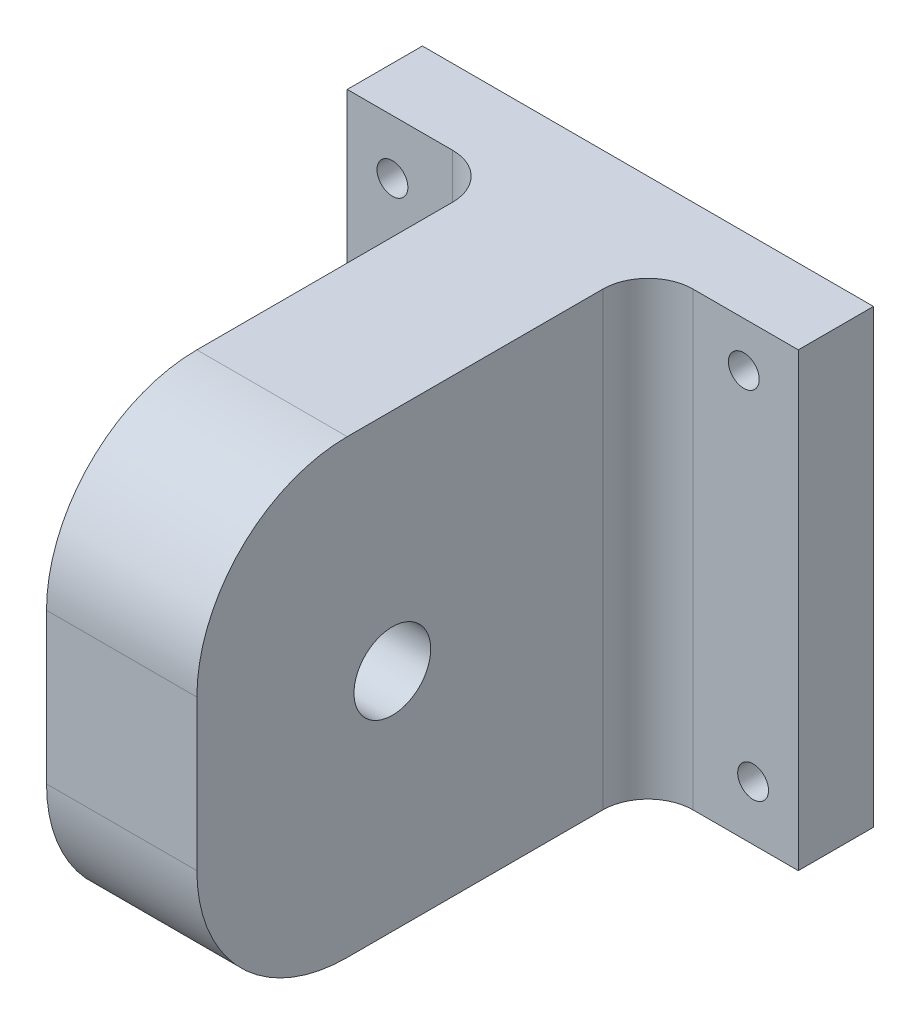
ISO-10303-21;
HEADER;
FILE_DESCRIPTION(('STEP AP214'),'2;1');
FILE_NAME('part.step','',(''),(''),'','','');
FILE_SCHEMA(('AUTOMOTIVE_DESIGN { 1 0 10303 214 1 1 1 1 }'));
ENDSEC;
DATA;
#1=APPLICATION_CONTEXT('core data for automotive mechanical design processes');
#2=APPLICATION_PROTOCOL_DEFINITION('international standard','automotive_design',2000,#1);
#3=PRODUCT_CONTEXT('',#1,'mechanical');
#4=PRODUCT('Part','Part','',(#3));
#5=PRODUCT_RELATED_PRODUCT_CATEGORY('part','',(#4));
#6=PRODUCT_DEFINITION_FORMATION('','',#4);
#7=PRODUCT_DEFINITION_CONTEXT('part definition',#1,'design');
#8=PRODUCT_DEFINITION('design','',#6,#7);
#9=PRODUCT_DEFINITION_SHAPE('','',#8);
#10=(LENGTH_UNIT() NAMED_UNIT(*) SI_UNIT(.MILLI.,.METRE.));
#11=(NAMED_UNIT(*) PLANE_ANGLE_UNIT() SI_UNIT($,.RADIAN.));
#12=(NAMED_UNIT(*) SI_UNIT($,.STERADIAN.) SOLID_ANGLE_UNIT());
#13=UNCERTAINTY_MEASURE_WITH_UNIT(LENGTH_MEASURE(1.E-05),#10,'distance_accuracy_value','');
#14=(GEOMETRIC_REPRESENTATION_CONTEXT(3) GLOBAL_UNCERTAINTY_ASSIGNED_CONTEXT((#13)) GLOBAL_UNIT_ASSIGNED_CONTEXT((#10,
#11,#12)) REPRESENTATION_CONTEXT('',''));
#15=CARTESIAN_POINT('',(0.,0.,0.));
#16=DIRECTION('',(0.,0.,1.));
#17=DIRECTION('',(1.,0.,0.));
#18=AXIS2_PLACEMENT_3D('',#15,#16,#17);
#19=CARTESIAN_POINT('',(0.,0.,5.));
#20=DIRECTION('',(0.,0.,1.));
#21=DIRECTION('',(1.,0.,0.));
#22=AXIS2_PLACEMENT_3D('',#19,#20,#21);
#23=PLANE('',#22);
#24=DIRECTION('',(1.,0.,0.));
#25=VECTOR('',#24,1.);
#26=CARTESIAN_POINT('',(-15.,-15.,5.));
#27=LINE('',#26,#25);
#28=CARTESIAN_POINT('',(-15.,-15.,5.));
#29=VERTEX_POINT('',#28);
#30=CARTESIAN_POINT('',(-8.,-15.,5.));
#31=VERTEX_POINT('',#30);
#32=EDGE_CURVE('E268',#29,#31,#27,.T.);
#33=ORIENTED_EDGE('',*,*,#32,.T.);
#34=DIRECTION('',(0.,-1.,0.));
#35=VECTOR('',#34,1.);
#36=CARTESIAN_POINT('',(-8.,0.,5.));
#37=LINE('',#36,#35);
#38=CARTESIAN_POINT('',(-8.,15.,5.));
#39=VERTEX_POINT('',#38);
#40=EDGE_CURVE('E61',#31,#39,#37,.F.);
#41=ORIENTED_EDGE('',*,*,#40,.T.);
#42=DIRECTION('',(-1.,0.,0.));
#43=VECTOR('',#42,1.);
#44=CARTESIAN_POINT('',(-15.,15.,5.));
#45=LINE('',#44,#43);
#46=CARTESIAN_POINT('',(-15.,15.,5.));
#47=VERTEX_POINT('',#46);
#48=EDGE_CURVE('E141',#39,#47,#45,.T.);
#49=ORIENTED_EDGE('',*,*,#48,.T.);
#50=DIRECTION('',(0.,-1.,0.));
#51=VECTOR('',#50,1.);
#52=CARTESIAN_POINT('',(-15.,15.,5.));
#53=LINE('',#52,#51);
#54=EDGE_CURVE('E140',#47,#29,#53,.T.);
#55=ORIENTED_EDGE('',*,*,#54,.T.);
#56=EDGE_LOOP('',(#33,#41,#49,#55));
#57=FACE_BOUND('',#56,.T.);
#58=CARTESIAN_POINT('',(-11.9939671001348,11.375061324506,5.));
#59=DIRECTION('',(0.,0.,1.));
#60=DIRECTION('',(1.,0.,0.));
#61=AXIS2_PLACEMENT_3D('',#58,#59,#60);
#62=CIRCLE('',#61,1.02617269029984);
#63=CARTESIAN_POINT('',(-10.967794409835,11.375061324506,5.));
#64=VERTEX_POINT('',#63);
#65=EDGE_CURVE('E243',#64,#64,#62,.T.);
#66=ORIENTED_EDGE('',*,*,#65,.F.);
#67=EDGE_LOOP('',(#66));
#68=FACE_BOUND('',#67,.T.);
#69=CARTESIAN_POINT('',(-11.3750613245053,-11.9939671001348,5.));
#70=DIRECTION('',(0.,0.,1.));
#71=DIRECTION('',(1.,0.,0.));
#72=AXIS2_PLACEMENT_3D('',#69,#70,#71);
#73=CIRCLE('',#72,1.02617269030017);
#74=CARTESIAN_POINT('',(-10.3488886342052,-11.9939671001348,5.));
#75=VERTEX_POINT('',#74);
#76=EDGE_CURVE('E226',#75,#75,#73,.T.);
#77=ORIENTED_EDGE('',*,*,#76,.F.);
#78=EDGE_LOOP('',(#77));
#79=FACE_BOUND('',#78,.T.);
#80=ADVANCED_FACE('F39',(#57,#68,#79),#23,.T.);
#81=CARTESIAN_POINT('',(15.,15.,5.));
#82=DIRECTION('',(-1.,0.,0.));
#83=DIRECTION('',(0.,-1.,0.));
#84=AXIS2_PLACEMENT_3D('',#81,#82,#83);
#85=PLANE('',#84);
#86=DIRECTION('',(0.,1.,0.));
#87=VECTOR('',#86,1.);
#88=CARTESIAN_POINT('',(15.,15.,0.));
#89=LINE('',#88,#87);
#90=CARTESIAN_POINT('',(15.,-15.,0.));
#91=VERTEX_POINT('',#90);
#92=CARTESIAN_POINT('',(15.,15.,0.));
#93=VERTEX_POINT('',#92);
#94=EDGE_CURVE('E157',#91,#93,#89,.T.);
#95=ORIENTED_EDGE('',*,*,#94,.T.);
#96=DIRECTION('',(0.,0.,-1.));
#97=VECTOR('',#96,1.);
#98=CARTESIAN_POINT('',(15.,15.,5.));
#99=LINE('',#98,#97);
#100=CARTESIAN_POINT('',(15.,15.,5.));
#101=VERTEX_POINT('',#100);
#102=EDGE_CURVE('E133',#101,#93,#99,.T.);
#103=ORIENTED_EDGE('',*,*,#102,.F.);
#104=DIRECTION('',(0.,1.,0.));
#105=VECTOR('',#104,1.);
#106=CARTESIAN_POINT('',(15.,15.,5.));
#107=LINE('',#106,#105);
#108=CARTESIAN_POINT('',(15.,-15.,5.));
#109=VERTEX_POINT('',#108);
#110=EDGE_CURVE('E144',#109,#101,#107,.T.);
#111=ORIENTED_EDGE('',*,*,#110,.F.);
#112=DIRECTION('',(0.,0.,-1.));
#113=VECTOR('',#112,1.);
#114=CARTESIAN_POINT('',(15.,-15.,5.));
#115=LINE('',#114,#113);
#116=EDGE_CURVE('E271',#109,#91,#115,.T.);
#117=ORIENTED_EDGE('',*,*,#116,.T.);
#118=EDGE_LOOP('',(#95,#103,#111,#117));
#119=FACE_BOUND('',#118,.T.);
#120=ADVANCED_FACE('F155',(#119),#85,.F.);
#121=CARTESIAN_POINT('',(-15.,15.,5.));
#122=DIRECTION('',(0.,-1.,0.));
#123=DIRECTION('',(0.,0.,-1.));
#124=AXIS2_PLACEMENT_3D('',#121,#122,#123);
#125=PLANE('',#124);
#126=DIRECTION('',(0.,0.,-1.));
#127=VECTOR('',#126,1.);
#128=CARTESIAN_POINT('',(-5.,15.,35.));
#129=LINE('',#128,#127);
#130=CARTESIAN_POINT('',(-5.,15.,25.));
#131=VERTEX_POINT('',#130);
#132=CARTESIAN_POINT('',(-5.,15.,8.));
#133=VERTEX_POINT('',#132);
#134=EDGE_CURVE('E219',#131,#133,#129,.T.);
#135=ORIENTED_EDGE('',*,*,#134,.F.);
#136=DIRECTION('',(-1.,0.,0.));
#137=VECTOR('',#136,1.);
#138=CARTESIAN_POINT('',(-15.,15.,25.));
#139=LINE('',#138,#137);
#140=CARTESIAN_POINT('',(5.,15.,25.));
#141=VERTEX_POINT('',#140);
#142=EDGE_CURVE('E188',#131,#141,#139,.F.);
#143=ORIENTED_EDGE('',*,*,#142,.T.);
#144=DIRECTION('',(0.,0.,-1.));
#145=VECTOR('',#144,1.);
#146=CARTESIAN_POINT('',(5.,15.,35.));
#147=LINE('',#146,#145);
#148=CARTESIAN_POINT('',(5.,15.,8.));
#149=VERTEX_POINT('',#148);
#150=EDGE_CURVE('E235',#141,#149,#147,.T.);
#151=ORIENTED_EDGE('',*,*,#150,.T.);
#152=CARTESIAN_POINT('',(8.,15.,8.));
#153=DIRECTION('',(0.,-1.,0.));
#154=DIRECTION('',(0.,0.,-1.));
#155=AXIS2_PLACEMENT_3D('',#152,#153,#154);
#156=CIRCLE('',#155,3.);
#157=CARTESIAN_POINT('',(8.,15.,5.));
#158=VERTEX_POINT('',#157);
#159=EDGE_CURVE('E136',#149,#158,#156,.T.);
#160=ORIENTED_EDGE('',*,*,#159,.T.);
#161=EDGE_CURVE('E128',#101,#158,#45,.T.);
#162=ORIENTED_EDGE('',*,*,#161,.F.);
#163=ORIENTED_EDGE('',*,*,#102,.T.);
#164=DIRECTION('',(-1.,0.,0.));
#165=VECTOR('',#164,1.);
#166=CARTESIAN_POINT('',(-15.,15.,0.));
#167=LINE('',#166,#165);
#168=CARTESIAN_POINT('',(-15.,15.,0.));
#169=VERTEX_POINT('',#168);
#170=EDGE_CURVE('E274',#93,#169,#167,.T.);
#171=ORIENTED_EDGE('',*,*,#170,.T.);
#172=DIRECTION('',(0.,0.,-1.));
#173=VECTOR('',#172,1.);
#174=CARTESIAN_POINT('',(-15.,15.,5.));
#175=LINE('',#174,#173);
#176=EDGE_CURVE('E160',#47,#169,#175,.T.);
#177=ORIENTED_EDGE('',*,*,#176,.F.);
#178=ORIENTED_EDGE('',*,*,#48,.F.);
#179=CARTESIAN_POINT('',(-8.,15.,8.));
#180=DIRECTION('',(0.,-1.,0.));
#181=DIRECTION('',(0.,0.,-1.));
#182=AXIS2_PLACEMENT_3D('',#179,#180,#181);
#183=CIRCLE('',#182,3.);
#184=EDGE_CURVE('E11',#39,#133,#183,.T.);
#185=ORIENTED_EDGE('',*,*,#184,.T.);
#186=EDGE_LOOP('',(#135,#143,#151,#160,#162,#163,#171,#177,#178,#185));
#187=FACE_BOUND('',#186,.T.);
#188=ADVANCED_FACE('F131',(#187),#125,.F.);
#189=CARTESIAN_POINT('',(-15.,15.,5.));
#190=DIRECTION('',(1.,0.,0.));
#191=DIRECTION('',(0.,1.,0.));
#192=AXIS2_PLACEMENT_3D('',#189,#190,#191);
#193=PLANE('',#192);
#194=DIRECTION('',(0.,-1.,0.));
#195=VECTOR('',#194,1.);
#196=CARTESIAN_POINT('',(-15.,15.,0.));
#197=LINE('',#196,#195);
#198=CARTESIAN_POINT('',(-15.,-15.,0.));
#199=VERTEX_POINT('',#198);
#200=EDGE_CURVE('E277',#169,#199,#197,.T.);
#201=ORIENTED_EDGE('',*,*,#200,.T.);
#202=DIRECTION('',(0.,0.,-1.));
#203=VECTOR('',#202,1.);
#204=CARTESIAN_POINT('',(-15.,-15.,5.));
#205=LINE('',#204,#203);
#206=EDGE_CURVE('E168',#29,#199,#205,.T.);
#207=ORIENTED_EDGE('',*,*,#206,.F.);
#208=ORIENTED_EDGE('',*,*,#54,.F.);
#209=ORIENTED_EDGE('',*,*,#176,.T.);
#210=EDGE_LOOP('',(#201,#207,#208,#209));
#211=FACE_BOUND('',#210,.T.);
#212=ADVANCED_FACE('F293',(#211),#193,.F.);
#213=CARTESIAN_POINT('',(-15.,-15.,5.));
#214=DIRECTION('',(0.,1.,0.));
#215=DIRECTION('',(0.,0.,1.));
#216=AXIS2_PLACEMENT_3D('',#213,#214,#215);
#217=PLANE('',#216);
#218=DIRECTION('',(0.,0.,-1.));
#219=VECTOR('',#218,1.);
#220=CARTESIAN_POINT('',(5.,-15.,35.));
#221=LINE('',#220,#219);
#222=CARTESIAN_POINT('',(5.,-15.,25.));
#223=VERTEX_POINT('',#222);
#224=CARTESIAN_POINT('',(5.,-15.,8.));
#225=VERTEX_POINT('',#224);
#226=EDGE_CURVE('E227',#223,#225,#221,.T.);
#227=ORIENTED_EDGE('',*,*,#226,.F.);
#228=DIRECTION('',(1.,0.,0.));
#229=VECTOR('',#228,1.);
#230=CARTESIAN_POINT('',(-15.,-15.,25.));
#231=LINE('',#230,#229);
#232=CARTESIAN_POINT('',(-5.,-15.,25.));
#233=VERTEX_POINT('',#232);
#234=EDGE_CURVE('E174',#223,#233,#231,.F.);
#235=ORIENTED_EDGE('',*,*,#234,.T.);
#236=DIRECTION('',(0.,0.,-1.));
#237=VECTOR('',#236,1.);
#238=CARTESIAN_POINT('',(-5.,-15.,35.));
#239=LINE('',#238,#237);
#240=CARTESIAN_POINT('',(-5.,-15.,8.));
#241=VERTEX_POINT('',#240);
#242=EDGE_CURVE('E217',#233,#241,#239,.T.);
#243=ORIENTED_EDGE('',*,*,#242,.T.);
#244=CARTESIAN_POINT('',(-8.,-15.,8.));
#245=DIRECTION('',(0.,1.,0.));
#246=DIRECTION('',(0.,0.,1.));
#247=AXIS2_PLACEMENT_3D('',#244,#245,#246);
#248=CIRCLE('',#247,3.);
#249=EDGE_CURVE('E48',#241,#31,#248,.T.);
#250=ORIENTED_EDGE('',*,*,#249,.T.);
#251=ORIENTED_EDGE('',*,*,#32,.F.);
#252=ORIENTED_EDGE('',*,*,#206,.T.);
#253=DIRECTION('',(1.,0.,0.));
#254=VECTOR('',#253,1.);
#255=CARTESIAN_POINT('',(-15.,-15.,0.));
#256=LINE('',#255,#254);
#257=EDGE_CURVE('E153',#199,#91,#256,.T.);
#258=ORIENTED_EDGE('',*,*,#257,.T.);
#259=ORIENTED_EDGE('',*,*,#116,.F.);
#260=CARTESIAN_POINT('',(8.,-15.,5.));
#261=VERTEX_POINT('',#260);
#262=EDGE_CURVE('E148',#261,#109,#27,.T.);
#263=ORIENTED_EDGE('',*,*,#262,.F.);
#264=CARTESIAN_POINT('',(8.,-15.,8.));
#265=DIRECTION('',(0.,1.,0.));
#266=DIRECTION('',(0.,0.,1.));
#267=AXIS2_PLACEMENT_3D('',#264,#265,#266);
#268=CIRCLE('',#267,3.);
#269=EDGE_CURVE('E203',#261,#225,#268,.T.);
#270=ORIENTED_EDGE('',*,*,#269,.T.);
#271=EDGE_LOOP('',(#227,#235,#243,#250,#251,#252,#258,#259,#263,#270));
#272=FACE_BOUND('',#271,.T.);
#273=ADVANCED_FACE('F223',(#272),#217,.F.);
#274=ORIENTED_EDGE('',*,*,#161,.T.);
#275=DIRECTION('',(0.,1.,0.));
#276=VECTOR('',#275,1.);
#277=CARTESIAN_POINT('',(8.,0.,5.));
#278=LINE('',#277,#276);
#279=EDGE_CURVE('E198',#158,#261,#278,.F.);
#280=ORIENTED_EDGE('',*,*,#279,.T.);
#281=ORIENTED_EDGE('',*,*,#262,.T.);
#282=ORIENTED_EDGE('',*,*,#110,.T.);
#283=EDGE_LOOP('',(#274,#280,#281,#282));
#284=FACE_BOUND('',#283,.T.);
#285=CARTESIAN_POINT('',(11.9939671001355,-11.3750613245053,5.));
#286=DIRECTION('',(0.,0.,1.));
#287=DIRECTION('',(1.,0.,0.));
#288=AXIS2_PLACEMENT_3D('',#285,#286,#287);
#289=CIRCLE('',#288,1.02617269030077);
#290=CARTESIAN_POINT('',(13.0201397904363,-11.3750613245053,5.));
#291=VERTEX_POINT('',#290);
#292=EDGE_CURVE('E252',#291,#291,#289,.T.);
#293=ORIENTED_EDGE('',*,*,#292,.F.);
#294=EDGE_LOOP('',(#293));
#295=FACE_BOUND('',#294,.T.);
#296=CARTESIAN_POINT('',(11.375061324506,11.9939671001355,5.));
#297=DIRECTION('',(0.,0.,1.));
#298=DIRECTION('',(1.,0.,0.));
#299=AXIS2_PLACEMENT_3D('',#296,#297,#298);
#300=CIRCLE('',#299,1.02617269030053);
#301=CARTESIAN_POINT('',(12.4012340148065,11.9939671001355,5.));
#302=VERTEX_POINT('',#301);
#303=EDGE_CURVE('E244',#302,#302,#300,.T.);
#304=ORIENTED_EDGE('',*,*,#303,.F.);
#305=EDGE_LOOP('',(#304));
#306=FACE_BOUND('',#305,.T.);
#307=ADVANCED_FACE('F145',(#284,#295,#306),#23,.T.);
#308=CARTESIAN_POINT('',(0.,0.,0.));
#309=DIRECTION('',(0.,0.,1.));
#310=DIRECTION('',(1.,0.,0.));
#311=AXIS2_PLACEMENT_3D('',#308,#309,#310);
#312=PLANE('',#311);
#313=CARTESIAN_POINT('',(-11.3750613245053,-11.9939671001348,0.));
#314=DIRECTION('',(0.,0.,1.));
#315=DIRECTION('',(1.,0.,0.));
#316=AXIS2_PLACEMENT_3D('',#313,#314,#315);
#317=CIRCLE('',#316,1.02617269030017);
#318=CARTESIAN_POINT('',(-10.3488886342052,-11.9939671001348,0.));
#319=VERTEX_POINT('',#318);
#320=EDGE_CURVE('E232',#319,#319,#317,.T.);
#321=ORIENTED_EDGE('',*,*,#320,.T.);
#322=EDGE_LOOP('',(#321));
#323=FACE_BOUND('',#322,.T.);
#324=CARTESIAN_POINT('',(11.9939671001355,-11.3750613245053,0.));
#325=DIRECTION('',(0.,0.,1.));
#326=DIRECTION('',(1.,0.,0.));
#327=AXIS2_PLACEMENT_3D('',#324,#325,#326);
#328=CIRCLE('',#327,1.02617269030077);
#329=CARTESIAN_POINT('',(13.0201397904363,-11.3750613245053,0.));
#330=VERTEX_POINT('',#329);
#331=EDGE_CURVE('E248',#330,#330,#328,.T.);
#332=ORIENTED_EDGE('',*,*,#331,.T.);
#333=EDGE_LOOP('',(#332));
#334=FACE_BOUND('',#333,.T.);
#335=CARTESIAN_POINT('',(11.375061324506,11.9939671001355,0.));
#336=DIRECTION('',(0.,0.,1.));
#337=DIRECTION('',(1.,0.,0.));
#338=AXIS2_PLACEMENT_3D('',#335,#336,#337);
#339=CIRCLE('',#338,1.02617269030053);
#340=CARTESIAN_POINT('',(12.4012340148065,11.9939671001355,0.));
#341=VERTEX_POINT('',#340);
#342=EDGE_CURVE('E239',#341,#341,#339,.T.);
#343=ORIENTED_EDGE('',*,*,#342,.T.);
#344=EDGE_LOOP('',(#343));
#345=FACE_BOUND('',#344,.T.);
#346=CARTESIAN_POINT('',(-11.9939671001348,11.375061324506,0.));
#347=DIRECTION('',(0.,0.,1.));
#348=DIRECTION('',(1.,0.,0.));
#349=AXIS2_PLACEMENT_3D('',#346,#347,#348);
#350=CIRCLE('',#349,1.02617269029984);
#351=CARTESIAN_POINT('',(-10.967794409835,11.375061324506,0.));
#352=VERTEX_POINT('',#351);
#353=EDGE_CURVE('E259',#352,#352,#350,.T.);
#354=ORIENTED_EDGE('',*,*,#353,.T.);
#355=EDGE_LOOP('',(#354));
#356=FACE_BOUND('',#355,.T.);
#357=ORIENTED_EDGE('',*,*,#94,.F.);
#358=ORIENTED_EDGE('',*,*,#257,.F.);
#359=ORIENTED_EDGE('',*,*,#200,.F.);
#360=ORIENTED_EDGE('',*,*,#170,.F.);
#361=EDGE_LOOP('',(#357,#358,#359,#360));
#362=FACE_BOUND('',#361,.T.);
#363=ADVANCED_FACE('F291',(#323,#334,#345,#356,#362),#312,.F.);
#364=CARTESIAN_POINT('',(-11.9939671001348,11.375061324506,0.));
#365=DIRECTION('',(0.,0.,1.));
#366=DIRECTION('',(1.,0.,0.));
#367=AXIS2_PLACEMENT_3D('',#364,#365,#366);
#368=CYLINDRICAL_SURFACE('',#367,1.02617269029984);
#369=ORIENTED_EDGE('',*,*,#353,.F.);
#370=EDGE_LOOP('',(#369));
#371=FACE_BOUND('',#370,.T.);
#372=ORIENTED_EDGE('',*,*,#65,.T.);
#373=EDGE_LOOP('',(#372));
#374=FACE_BOUND('',#373,.T.);
#375=ADVANCED_FACE('F317',(#371,#374),#368,.F.);
#376=CARTESIAN_POINT('',(11.375061324506,11.9939671001355,0.));
#377=DIRECTION('',(0.,0.,1.));
#378=DIRECTION('',(1.,0.,0.));
#379=AXIS2_PLACEMENT_3D('',#376,#377,#378);
#380=CYLINDRICAL_SURFACE('',#379,1.02617269030053);
#381=ORIENTED_EDGE('',*,*,#342,.F.);
#382=EDGE_LOOP('',(#381));
#383=FACE_BOUND('',#382,.T.);
#384=ORIENTED_EDGE('',*,*,#303,.T.);
#385=EDGE_LOOP('',(#384));
#386=FACE_BOUND('',#385,.T.);
#387=ADVANCED_FACE('F381',(#383,#386),#380,.F.);
#388=CARTESIAN_POINT('',(11.9939671001355,-11.3750613245053,0.));
#389=DIRECTION('',(0.,0.,1.));
#390=DIRECTION('',(1.,0.,0.));
#391=AXIS2_PLACEMENT_3D('',#388,#389,#390);
#392=CYLINDRICAL_SURFACE('',#391,1.02617269030077);
#393=ORIENTED_EDGE('',*,*,#331,.F.);
#394=EDGE_LOOP('',(#393));
#395=FACE_BOUND('',#394,.T.);
#396=ORIENTED_EDGE('',*,*,#292,.T.);
#397=EDGE_LOOP('',(#396));
#398=FACE_BOUND('',#397,.T.);
#399=ADVANCED_FACE('F384',(#395,#398),#392,.F.);
#400=CARTESIAN_POINT('',(-11.3750613245053,-11.9939671001348,0.));
#401=DIRECTION('',(0.,0.,1.));
#402=DIRECTION('',(1.,0.,0.));
#403=AXIS2_PLACEMENT_3D('',#400,#401,#402);
#404=CYLINDRICAL_SURFACE('',#403,1.02617269030017);
#405=ORIENTED_EDGE('',*,*,#320,.F.);
#406=EDGE_LOOP('',(#405));
#407=FACE_BOUND('',#406,.T.);
#408=ORIENTED_EDGE('',*,*,#76,.T.);
#409=EDGE_LOOP('',(#408));
#410=FACE_BOUND('',#409,.T.);
#411=ADVANCED_FACE('F376',(#407,#410),#404,.F.);
#412=CARTESIAN_POINT('',(-5.,15.,35.));
#413=DIRECTION('',(1.,0.,0.));
#414=DIRECTION('',(0.,0.,-1.));
#415=AXIS2_PLACEMENT_3D('',#412,#413,#414);
#416=PLANE('',#415);
#417=CARTESIAN_POINT('',(-5.,0.,22.));
#418=DIRECTION('',(1.,0.,0.));
#419=DIRECTION('',(0.,0.,-1.));
#420=AXIS2_PLACEMENT_3D('',#417,#418,#419);
#421=CIRCLE('',#420,2.55);
#422=CARTESIAN_POINT('',(-5.,0.,19.45));
#423=VERTEX_POINT('',#422);
#424=EDGE_CURVE('E355',#423,#423,#421,.T.);
#425=ORIENTED_EDGE('',*,*,#424,.T.);
#426=EDGE_LOOP('',(#425));
#427=FACE_BOUND('',#426,.T.);
#428=ORIENTED_EDGE('',*,*,#134,.T.);
#429=DIRECTION('',(0.,-1.,0.));
#430=VECTOR('',#429,1.);
#431=CARTESIAN_POINT('',(-5.,15.,8.));
#432=LINE('',#431,#430);
#433=EDGE_CURVE('E206',#133,#241,#432,.T.);
#434=ORIENTED_EDGE('',*,*,#433,.T.);
#435=ORIENTED_EDGE('',*,*,#242,.F.);
#436=CARTESIAN_POINT('',(-5.,-5.,25.));
#437=DIRECTION('',(1.,0.,0.));
#438=DIRECTION('',(0.,0.,-1.));
#439=AXIS2_PLACEMENT_3D('',#436,#437,#438);
#440=CIRCLE('',#439,10.);
#441=CARTESIAN_POINT('',(-5.,-5.,35.));
#442=VERTEX_POINT('',#441);
#443=EDGE_CURVE('E177',#233,#442,#440,.F.);
#444=ORIENTED_EDGE('',*,*,#443,.T.);
#445=DIRECTION('',(0.,-1.,0.));
#446=VECTOR('',#445,1.);
#447=CARTESIAN_POINT('',(-5.,15.,35.));
#448=LINE('',#447,#446);
#449=CARTESIAN_POINT('',(-5.,5.,35.));
#450=VERTEX_POINT('',#449);
#451=EDGE_CURVE('E350',#450,#442,#448,.T.);
#452=ORIENTED_EDGE('',*,*,#451,.F.);
#453=CARTESIAN_POINT('',(-5.,5.,25.));
#454=DIRECTION('',(1.,0.,0.));
#455=DIRECTION('',(0.,0.,-1.));
#456=AXIS2_PLACEMENT_3D('',#453,#454,#455);
#457=CIRCLE('',#456,10.);
#458=EDGE_CURVE('E185',#450,#131,#457,.F.);
#459=ORIENTED_EDGE('',*,*,#458,.T.);
#460=EDGE_LOOP('',(#428,#434,#435,#444,#452,#459));
#461=FACE_BOUND('',#460,.T.);
#462=ADVANCED_FACE('F216',(#427,#461),#416,.F.);
#463=CARTESIAN_POINT('',(5.,15.,35.));
#464=DIRECTION('',(-1.,0.,0.));
#465=DIRECTION('',(0.,0.,1.));
#466=AXIS2_PLACEMENT_3D('',#463,#464,#465);
#467=PLANE('',#466);
#468=CARTESIAN_POINT('',(5.,0.,22.));
#469=DIRECTION('',(1.,0.,0.));
#470=DIRECTION('',(0.,0.,-1.));
#471=AXIS2_PLACEMENT_3D('',#468,#469,#470);
#472=CIRCLE('',#471,2.55);
#473=CARTESIAN_POINT('',(5.,0.,19.45));
#474=VERTEX_POINT('',#473);
#475=EDGE_CURVE('E362',#474,#474,#472,.T.);
#476=ORIENTED_EDGE('',*,*,#475,.F.);
#477=EDGE_LOOP('',(#476));
#478=FACE_BOUND('',#477,.T.);
#479=ORIENTED_EDGE('',*,*,#226,.T.);
#480=DIRECTION('',(0.,1.,0.));
#481=VECTOR('',#480,1.);
#482=CARTESIAN_POINT('',(5.,15.,8.));
#483=LINE('',#482,#481);
#484=EDGE_CURVE('E194',#225,#149,#483,.T.);
#485=ORIENTED_EDGE('',*,*,#484,.T.);
#486=ORIENTED_EDGE('',*,*,#150,.F.);
#487=CARTESIAN_POINT('',(5.,5.,25.));
#488=DIRECTION('',(-1.,0.,0.));
#489=DIRECTION('',(0.,0.,1.));
#490=AXIS2_PLACEMENT_3D('',#487,#488,#489);
#491=CIRCLE('',#490,10.);
#492=CARTESIAN_POINT('',(5.,5.,35.));
#493=VERTEX_POINT('',#492);
#494=EDGE_CURVE('E191',#141,#493,#491,.F.);
#495=ORIENTED_EDGE('',*,*,#494,.T.);
#496=DIRECTION('',(0.,1.,0.));
#497=VECTOR('',#496,1.);
#498=CARTESIAN_POINT('',(5.,15.,35.));
#499=LINE('',#498,#497);
#500=CARTESIAN_POINT('',(5.,-5.,35.));
#501=VERTEX_POINT('',#500);
#502=EDGE_CURVE('E344',#501,#493,#499,.T.);
#503=ORIENTED_EDGE('',*,*,#502,.F.);
#504=CARTESIAN_POINT('',(5.,-5.,25.));
#505=DIRECTION('',(-1.,0.,0.));
#506=DIRECTION('',(0.,0.,1.));
#507=AXIS2_PLACEMENT_3D('',#504,#505,#506);
#508=CIRCLE('',#507,10.);
#509=EDGE_CURVE('E165',#501,#223,#508,.F.);
#510=ORIENTED_EDGE('',*,*,#509,.T.);
#511=EDGE_LOOP('',(#479,#485,#486,#495,#503,#510));
#512=FACE_BOUND('',#511,.T.);
#513=ADVANCED_FACE('F343',(#478,#512),#467,.F.);
#514=CARTESIAN_POINT('',(0.,0.,35.));
#515=DIRECTION('',(0.,0.,-1.));
#516=DIRECTION('',(-1.,0.,0.));
#517=AXIS2_PLACEMENT_3D('',#514,#515,#516);
#518=PLANE('',#517);
#519=ORIENTED_EDGE('',*,*,#502,.T.);
#520=DIRECTION('',(-1.,0.,0.));
#521=VECTOR('',#520,1.);
#522=CARTESIAN_POINT('',(0.,5.,35.));
#523=LINE('',#522,#521);
#524=EDGE_CURVE('E181',#493,#450,#523,.T.);
#525=ORIENTED_EDGE('',*,*,#524,.T.);
#526=ORIENTED_EDGE('',*,*,#451,.T.);
#527=DIRECTION('',(1.,0.,0.));
#528=VECTOR('',#527,1.);
#529=CARTESIAN_POINT('',(0.,-5.,35.));
#530=LINE('',#529,#528);
#531=EDGE_CURVE('E159',#442,#501,#530,.T.);
#532=ORIENTED_EDGE('',*,*,#531,.T.);
#533=EDGE_LOOP('',(#519,#525,#526,#532));
#534=FACE_BOUND('',#533,.T.);
#535=ADVANCED_FACE('F346',(#534),#518,.F.);
#536=CARTESIAN_POINT('',(-25.,0.,22.));
#537=DIRECTION('',(1.,0.,0.));
#538=DIRECTION('',(0.,0.,-1.));
#539=AXIS2_PLACEMENT_3D('',#536,#537,#538);
#540=CYLINDRICAL_SURFACE('',#539,2.55);
#541=ORIENTED_EDGE('',*,*,#475,.T.);
#542=EDGE_LOOP('',(#541));
#543=FACE_BOUND('',#542,.T.);
#544=ORIENTED_EDGE('',*,*,#424,.F.);
#545=EDGE_LOOP('',(#544));
#546=FACE_BOUND('',#545,.T.);
#547=ADVANCED_FACE('F330',(#543,#546),#540,.F.);
#548=CARTESIAN_POINT('',(0.,-5.,25.));
#549=DIRECTION('',(1.,0.,0.));
#550=DIRECTION('',(0.,0.,-1.));
#551=AXIS2_PLACEMENT_3D('',#548,#549,#550);
#552=CYLINDRICAL_SURFACE('',#551,10.);
#553=ORIENTED_EDGE('',*,*,#443,.F.);
#554=ORIENTED_EDGE('',*,*,#234,.F.);
#555=ORIENTED_EDGE('',*,*,#509,.F.);
#556=ORIENTED_EDGE('',*,*,#531,.F.);
#557=EDGE_LOOP('',(#553,#554,#555,#556));
#558=FACE_BOUND('',#557,.T.);
#559=ADVANCED_FACE('F327',(#558),#552,.T.);
#560=CARTESIAN_POINT('',(0.,5.,25.));
#561=DIRECTION('',(-1.,0.,0.));
#562=DIRECTION('',(0.,0.,1.));
#563=AXIS2_PLACEMENT_3D('',#560,#561,#562);
#564=CYLINDRICAL_SURFACE('',#563,10.);
#565=ORIENTED_EDGE('',*,*,#494,.F.);
#566=ORIENTED_EDGE('',*,*,#142,.F.);
#567=ORIENTED_EDGE('',*,*,#458,.F.);
#568=ORIENTED_EDGE('',*,*,#524,.F.);
#569=EDGE_LOOP('',(#565,#566,#567,#568));
#570=FACE_BOUND('',#569,.T.);
#571=ADVANCED_FACE('F302',(#570),#564,.T.);
#572=CARTESIAN_POINT('',(8.,15.,8.));
#573=DIRECTION('',(0.,1.,0.));
#574=DIRECTION('',(0.,0.,1.));
#575=AXIS2_PLACEMENT_3D('',#572,#573,#574);
#576=CYLINDRICAL_SURFACE('',#575,3.);
#577=ORIENTED_EDGE('',*,*,#269,.F.);
#578=ORIENTED_EDGE('',*,*,#279,.F.);
#579=ORIENTED_EDGE('',*,*,#159,.F.);
#580=ORIENTED_EDGE('',*,*,#484,.F.);
#581=EDGE_LOOP('',(#577,#578,#579,#580));
#582=FACE_BOUND('',#581,.T.);
#583=ADVANCED_FACE('F298',(#582),#576,.F.);
#584=CARTESIAN_POINT('',(-8.,15.,8.));
#585=DIRECTION('',(0.,-1.,0.));
#586=DIRECTION('',(0.,0.,-1.));
#587=AXIS2_PLACEMENT_3D('',#584,#585,#586);
#588=CYLINDRICAL_SURFACE('',#587,3.);
#589=ORIENTED_EDGE('',*,*,#184,.F.);
#590=ORIENTED_EDGE('',*,*,#40,.F.);
#591=ORIENTED_EDGE('',*,*,#249,.F.);
#592=ORIENTED_EDGE('',*,*,#433,.F.);
#593=EDGE_LOOP('',(#589,#590,#591,#592));
#594=FACE_BOUND('',#593,.T.);
#595=ADVANCED_FACE('F41',(#594),#588,.F.);
#596=CLOSED_SHELL('',(#80,#120,#188,#212,#273,#307,#363,#375,#387,#399,#411,#462,#513,#535,#547,
#559,#571,#583,#595));
#597=MANIFOLD_SOLID_BREP('B2',#596);
#598=ADVANCED_BREP_SHAPE_REPRESENTATION('',(#18,#597),#14);
#599=SHAPE_DEFINITION_REPRESENTATION(#9,#598);
ENDSEC;
END-ISO-10303-21;
